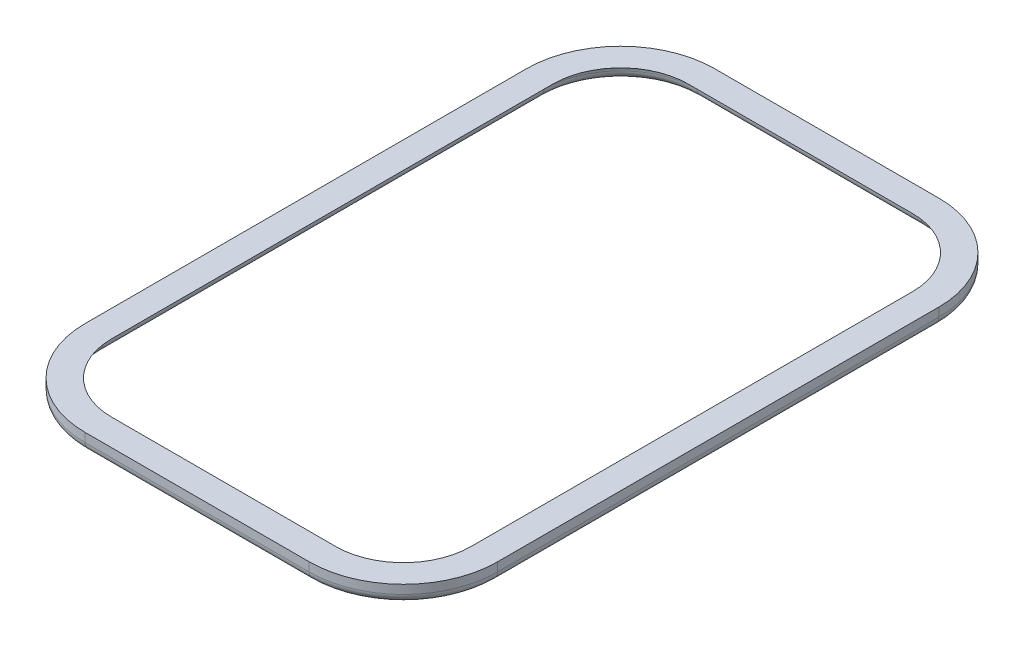
ISO-10303-21;
HEADER;
FILE_DESCRIPTION(('STEP AP214'),'2;1');
FILE_NAME('part.step','',(''),(''),'','','');
FILE_SCHEMA(('AUTOMOTIVE_DESIGN { 1 0 10303 214 1 1 1 1 }'));
ENDSEC;
DATA;
#1=APPLICATION_CONTEXT('core data for automotive mechanical design processes');
#2=APPLICATION_PROTOCOL_DEFINITION('international standard','automotive_design',2000,#1);
#3=PRODUCT_CONTEXT('',#1,'mechanical');
#4=PRODUCT('Part','Part','',(#3));
#5=PRODUCT_RELATED_PRODUCT_CATEGORY('part','',(#4));
#6=PRODUCT_DEFINITION_FORMATION('','',#4);
#7=PRODUCT_DEFINITION_CONTEXT('part definition',#1,'design');
#8=PRODUCT_DEFINITION('design','',#6,#7);
#9=PRODUCT_DEFINITION_SHAPE('','',#8);
#10=(LENGTH_UNIT() NAMED_UNIT(*) SI_UNIT(.MILLI.,.METRE.));
#11=(NAMED_UNIT(*) PLANE_ANGLE_UNIT() SI_UNIT($,.RADIAN.));
#12=(NAMED_UNIT(*) SI_UNIT($,.STERADIAN.) SOLID_ANGLE_UNIT());
#13=UNCERTAINTY_MEASURE_WITH_UNIT(LENGTH_MEASURE(1.E-05),#10,'distance_accuracy_value','');
#14=(GEOMETRIC_REPRESENTATION_CONTEXT(3) GLOBAL_UNCERTAINTY_ASSIGNED_CONTEXT((#13)) GLOBAL_UNIT_ASSIGNED_CONTEXT((#10,
#11,#12)) REPRESENTATION_CONTEXT('',''));
#15=CARTESIAN_POINT('',(0.,0.,0.));
#16=DIRECTION('',(0.,0.,1.));
#17=DIRECTION('',(1.,0.,0.));
#18=AXIS2_PLACEMENT_3D('',#15,#16,#17);
#19=CARTESIAN_POINT('',(51.1,0.,-86.5));
#20=DIRECTION('',(0.,-1.,0.));
#21=DIRECTION('',(0.,0.,-1.));
#22=AXIS2_PLACEMENT_3D('',#19,#20,#21);
#23=PLANE('',#22);
#24=CARTESIAN_POINT('',(51.1,0.,-75.));
#25=DIRECTION('',(0.,-1.,0.));
#26=DIRECTION('',(0.,0.,-1.));
#27=AXIS2_PLACEMENT_3D('',#24,#25,#26);
#28=CIRCLE('',#27,16.);
#29=CARTESIAN_POINT('',(67.1,0.,-75.));
#30=VERTEX_POINT('',#29);
#31=CARTESIAN_POINT('',(51.1,0.,-91.));
#32=VERTEX_POINT('',#31);
#33=EDGE_CURVE('E231',#30,#32,#28,.F.);
#34=ORIENTED_EDGE('',*,*,#33,.T.);
#35=DIRECTION('',(-1.,0.,0.));
#36=VECTOR('',#35,1.);
#37=CARTESIAN_POINT('',(0.,0.,-91.));
#38=LINE('',#37,#36);
#39=CARTESIAN_POINT('',(13.,0.,-91.));
#40=VERTEX_POINT('',#39);
#41=EDGE_CURVE('E225',#32,#40,#38,.T.);
#42=ORIENTED_EDGE('',*,*,#41,.T.);
#43=CARTESIAN_POINT('',(13.,0.,-75.));
#44=DIRECTION('',(0.,-1.,0.));
#45=DIRECTION('',(0.,0.,-1.));
#46=AXIS2_PLACEMENT_3D('',#43,#44,#45);
#47=CIRCLE('',#46,16.);
#48=CARTESIAN_POINT('',(-3.00000000000003,0.,-75.));
#49=VERTEX_POINT('',#48);
#50=EDGE_CURVE('E228',#40,#49,#47,.F.);
#51=ORIENTED_EDGE('',*,*,#50,.T.);
#52=DIRECTION('',(0.,0.,1.));
#53=VECTOR('',#52,1.);
#54=CARTESIAN_POINT('',(-3.00000000000003,0.,0.));
#55=LINE('',#54,#53);
#56=CARTESIAN_POINT('',(-3.,0.,0.));
#57=VERTEX_POINT('',#56);
#58=EDGE_CURVE('E221',#49,#57,#55,.T.);
#59=ORIENTED_EDGE('',*,*,#58,.T.);
#60=CARTESIAN_POINT('',(13.,0.,0.));
#61=DIRECTION('',(0.,-1.,0.));
#62=DIRECTION('',(0.,0.,-1.));
#63=AXIS2_PLACEMENT_3D('',#60,#61,#62);
#64=CIRCLE('',#63,16.);
#65=CARTESIAN_POINT('',(13.,0.,16.));
#66=VERTEX_POINT('',#65);
#67=EDGE_CURVE('E237',#57,#66,#64,.F.);
#68=ORIENTED_EDGE('',*,*,#67,.T.);
#69=DIRECTION('',(-1.,0.,0.));
#70=VECTOR('',#69,1.);
#71=CARTESIAN_POINT('',(0.,0.,16.));
#72=LINE('',#71,#70);
#73=CARTESIAN_POINT('',(51.1,0.,16.));
#74=VERTEX_POINT('',#73);
#75=EDGE_CURVE('E188',#74,#66,#72,.T.);
#76=ORIENTED_EDGE('',*,*,#75,.F.);
#77=CARTESIAN_POINT('',(51.1,0.,0.));
#78=DIRECTION('',(0.,-1.,0.));
#79=DIRECTION('',(0.,0.,-1.));
#80=AXIS2_PLACEMENT_3D('',#77,#78,#79);
#81=CIRCLE('',#80,16.);
#82=CARTESIAN_POINT('',(67.1,0.,0.));
#83=VERTEX_POINT('',#82);
#84=EDGE_CURVE('E234',#74,#83,#81,.F.);
#85=ORIENTED_EDGE('',*,*,#84,.T.);
#86=DIRECTION('',(0.,0.,1.));
#87=VECTOR('',#86,1.);
#88=CARTESIAN_POINT('',(67.1,0.,0.));
#89=LINE('',#88,#87);
#90=EDGE_CURVE('E224',#30,#83,#89,.T.);
#91=ORIENTED_EDGE('',*,*,#90,.F.);
#92=EDGE_LOOP('',(#34,#42,#51,#59,#68,#76,#85,#91));
#93=FACE_BOUND('',#92,.T.);
#94=CARTESIAN_POINT('',(13.,0.,-75.));
#95=DIRECTION('',(0.,1.,0.));
#96=DIRECTION('',(0.,0.,1.));
#97=AXIS2_PLACEMENT_3D('',#94,#95,#96);
#98=CIRCLE('',#97,11.5);
#99=CARTESIAN_POINT('',(1.49999999999997,0.,-75.));
#100=VERTEX_POINT('',#99);
#101=CARTESIAN_POINT('',(13.,0.,-86.5));
#102=VERTEX_POINT('',#101);
#103=EDGE_CURVE('E246',#100,#102,#98,.F.);
#104=ORIENTED_EDGE('',*,*,#103,.T.);
#105=DIRECTION('',(1.,0.,0.));
#106=VECTOR('',#105,1.);
#107=CARTESIAN_POINT('',(0.,0.,-86.5));
#108=LINE('',#107,#106);
#109=CARTESIAN_POINT('',(51.1,0.,-86.5));
#110=VERTEX_POINT('',#109);
#111=EDGE_CURVE('E243',#102,#110,#108,.T.);
#112=ORIENTED_EDGE('',*,*,#111,.T.);
#113=CARTESIAN_POINT('',(51.1,0.,-75.));
#114=DIRECTION('',(0.,1.,0.));
#115=DIRECTION('',(0.,0.,1.));
#116=AXIS2_PLACEMENT_3D('',#113,#114,#115);
#117=CIRCLE('',#116,11.5);
#118=CARTESIAN_POINT('',(62.6,0.,-75.));
#119=VERTEX_POINT('',#118);
#120=EDGE_CURVE('E240',#110,#119,#117,.F.);
#121=ORIENTED_EDGE('',*,*,#120,.T.);
#122=DIRECTION('',(0.,0.,1.));
#123=VECTOR('',#122,1.);
#124=CARTESIAN_POINT('',(62.6,0.,0.));
#125=LINE('',#124,#123);
#126=CARTESIAN_POINT('',(62.6,0.,0.));
#127=VERTEX_POINT('',#126);
#128=EDGE_CURVE('E44',#119,#127,#125,.T.);
#129=ORIENTED_EDGE('',*,*,#128,.T.);
#130=CARTESIAN_POINT('',(51.1,0.,0.));
#131=DIRECTION('',(0.,1.,0.));
#132=DIRECTION('',(0.,0.,1.));
#133=AXIS2_PLACEMENT_3D('',#130,#131,#132);
#134=CIRCLE('',#133,11.5);
#135=CARTESIAN_POINT('',(51.1,0.,11.5));
#136=VERTEX_POINT('',#135);
#137=EDGE_CURVE('E257',#127,#136,#134,.F.);
#138=ORIENTED_EDGE('',*,*,#137,.T.);
#139=DIRECTION('',(-1.,0.,0.));
#140=VECTOR('',#139,1.);
#141=CARTESIAN_POINT('',(0.,0.,11.5));
#142=LINE('',#141,#140);
#143=CARTESIAN_POINT('',(13.,0.,11.5));
#144=VERTEX_POINT('',#143);
#145=EDGE_CURVE('E255',#136,#144,#142,.T.);
#146=ORIENTED_EDGE('',*,*,#145,.T.);
#147=CARTESIAN_POINT('',(13.,0.,0.));
#148=DIRECTION('',(0.,1.,0.));
#149=DIRECTION('',(0.,0.,1.));
#150=AXIS2_PLACEMENT_3D('',#147,#148,#149);
#151=CIRCLE('',#150,11.5);
#152=CARTESIAN_POINT('',(1.49999999999997,0.,0.));
#153=VERTEX_POINT('',#152);
#154=EDGE_CURVE('E252',#144,#153,#151,.F.);
#155=ORIENTED_EDGE('',*,*,#154,.T.);
#156=DIRECTION('',(0.,0.,-1.));
#157=VECTOR('',#156,1.);
#158=CARTESIAN_POINT('',(1.49999999999997,0.,0.));
#159=LINE('',#158,#157);
#160=EDGE_CURVE('E249',#153,#100,#159,.T.);
#161=ORIENTED_EDGE('',*,*,#160,.T.);
#162=EDGE_LOOP('',(#104,#112,#121,#129,#138,#146,#155,#161));
#163=FACE_BOUND('',#162,.T.);
#164=ADVANCED_FACE('F41',(#93,#163),#23,.F.);
#165=CARTESIAN_POINT('',(65.6,-1.5,0.));
#166=DIRECTION('',(0.,0.,-1.));
#167=DIRECTION('',(-1.,0.,0.));
#168=AXIS2_PLACEMENT_3D('',#165,#166,#167);
#169=CYLINDRICAL_SURFACE('',#168,1.5);
#170=CARTESIAN_POINT('',(65.6,-1.5,-75.));
#171=DIRECTION('',(0.,0.,1.));
#172=DIRECTION('',(1.,0.,0.));
#173=AXIS2_PLACEMENT_3D('',#170,#171,#172);
#174=CIRCLE('',#173,1.5);
#175=CARTESIAN_POINT('',(65.6,-3.,-75.));
#176=VERTEX_POINT('',#175);
#177=CARTESIAN_POINT('',(67.1,-1.49999999999999,-75.));
#178=VERTEX_POINT('',#177);
#179=EDGE_CURVE('E179',#176,#178,#174,.T.);
#180=ORIENTED_EDGE('',*,*,#179,.T.);
#181=DIRECTION('',(0.,0.,1.));
#182=VECTOR('',#181,1.);
#183=CARTESIAN_POINT('',(67.1,-1.5,-75.));
#184=LINE('',#183,#182);
#185=CARTESIAN_POINT('',(67.1,-1.49999999999999,0.));
#186=VERTEX_POINT('',#185);
#187=EDGE_CURVE('E203',#186,#178,#184,.F.);
#188=ORIENTED_EDGE('',*,*,#187,.F.);
#189=CARTESIAN_POINT('',(65.6,-1.5,0.));
#190=DIRECTION('',(0.,0.,-1.));
#191=DIRECTION('',(-1.,0.,0.));
#192=AXIS2_PLACEMENT_3D('',#189,#190,#191);
#193=CIRCLE('',#192,1.5);
#194=CARTESIAN_POINT('',(65.6,-3.,0.));
#195=VERTEX_POINT('',#194);
#196=EDGE_CURVE('E11',#186,#195,#193,.T.);
#197=ORIENTED_EDGE('',*,*,#196,.T.);
#198=DIRECTION('',(0.,0.,1.));
#199=VECTOR('',#198,1.);
#200=CARTESIAN_POINT('',(65.6,-3.,0.));
#201=LINE('',#200,#199);
#202=EDGE_CURVE('E50',#195,#176,#201,.F.);
#203=ORIENTED_EDGE('',*,*,#202,.T.);
#204=EDGE_LOOP('',(#180,#188,#197,#203));
#205=FACE_BOUND('',#204,.T.);
#206=ADVANCED_FACE('F302',(#205),#169,.T.);
#207=CARTESIAN_POINT('',(-1.50000000000003,-1.5,0.));
#208=DIRECTION('',(0.,0.,-1.));
#209=DIRECTION('',(-1.,0.,0.));
#210=AXIS2_PLACEMENT_3D('',#207,#208,#209);
#211=CYLINDRICAL_SURFACE('',#210,1.5);
#212=CARTESIAN_POINT('',(-1.50000000000003,-1.5,0.));
#213=DIRECTION('',(0.,0.,1.));
#214=DIRECTION('',(1.,0.,0.));
#215=AXIS2_PLACEMENT_3D('',#212,#213,#214);
#216=CIRCLE('',#215,1.5);
#217=CARTESIAN_POINT('',(-3.,-1.49999999999999,0.));
#218=VERTEX_POINT('',#217);
#219=CARTESIAN_POINT('',(-1.50000000000003,-3.,0.));
#220=VERTEX_POINT('',#219);
#221=EDGE_CURVE('E353',#218,#220,#216,.T.);
#222=ORIENTED_EDGE('',*,*,#221,.F.);
#223=DIRECTION('',(0.,0.,-1.));
#224=VECTOR('',#223,1.);
#225=CARTESIAN_POINT('',(-3.00000000000003,-1.5,0.));
#226=LINE('',#225,#224);
#227=CARTESIAN_POINT('',(-3.00000000000003,-1.49999999999999,-75.));
#228=VERTEX_POINT('',#227);
#229=EDGE_CURVE('E193',#228,#218,#226,.F.);
#230=ORIENTED_EDGE('',*,*,#229,.F.);
#231=CARTESIAN_POINT('',(-1.50000000000003,-1.5,-75.));
#232=DIRECTION('',(0.,0.,-1.));
#233=DIRECTION('',(-1.,0.,0.));
#234=AXIS2_PLACEMENT_3D('',#231,#232,#233);
#235=CIRCLE('',#234,1.5);
#236=CARTESIAN_POINT('',(-1.50000000000003,-3.,-75.));
#237=VERTEX_POINT('',#236);
#238=EDGE_CURVE('E375',#237,#228,#235,.T.);
#239=ORIENTED_EDGE('',*,*,#238,.F.);
#240=DIRECTION('',(0.,0.,-1.));
#241=VECTOR('',#240,1.);
#242=CARTESIAN_POINT('',(-1.50000000000003,-3.,0.));
#243=LINE('',#242,#241);
#244=EDGE_CURVE('E378',#237,#220,#243,.F.);
#245=ORIENTED_EDGE('',*,*,#244,.T.);
#246=EDGE_LOOP('',(#222,#230,#239,#245));
#247=FACE_BOUND('',#246,.T.);
#248=ADVANCED_FACE('F478',(#247),#211,.T.);
#249=CARTESIAN_POINT('',(0.,-1.5,14.5));
#250=DIRECTION('',(1.,0.,0.));
#251=DIRECTION('',(0.,0.,-1.));
#252=AXIS2_PLACEMENT_3D('',#249,#250,#251);
#253=CYLINDRICAL_SURFACE('',#252,1.5);
#254=CARTESIAN_POINT('',(13.,-1.5,14.5));
#255=DIRECTION('',(1.,0.,0.));
#256=DIRECTION('',(0.,0.,-1.));
#257=AXIS2_PLACEMENT_3D('',#254,#255,#256);
#258=CIRCLE('',#257,1.5);
#259=CARTESIAN_POINT('',(13.,-1.5,16.));
#260=VERTEX_POINT('',#259);
#261=CARTESIAN_POINT('',(13.,-3.,14.5));
#262=VERTEX_POINT('',#261);
#263=EDGE_CURVE('E169',#260,#262,#258,.T.);
#264=ORIENTED_EDGE('',*,*,#263,.T.);
#265=DIRECTION('',(-1.,0.,0.));
#266=VECTOR('',#265,1.);
#267=CARTESIAN_POINT('',(0.,-3.,14.5));
#268=LINE('',#267,#266);
#269=CARTESIAN_POINT('',(51.1,-3.,14.5));
#270=VERTEX_POINT('',#269);
#271=EDGE_CURVE('E154',#262,#270,#268,.F.);
#272=ORIENTED_EDGE('',*,*,#271,.T.);
#273=CARTESIAN_POINT('',(51.1,-1.5,14.5));
#274=DIRECTION('',(1.,0.,0.));
#275=DIRECTION('',(0.,0.,-1.));
#276=AXIS2_PLACEMENT_3D('',#273,#274,#275);
#277=CIRCLE('',#276,1.5);
#278=CARTESIAN_POINT('',(51.1,-1.5,16.));
#279=VERTEX_POINT('',#278);
#280=EDGE_CURVE('E166',#279,#270,#277,.T.);
#281=ORIENTED_EDGE('',*,*,#280,.F.);
#282=DIRECTION('',(-1.,0.,0.));
#283=VECTOR('',#282,1.);
#284=CARTESIAN_POINT('',(51.1,-1.5,16.));
#285=LINE('',#284,#283);
#286=EDGE_CURVE('E187',#260,#279,#285,.F.);
#287=ORIENTED_EDGE('',*,*,#286,.F.);
#288=EDGE_LOOP('',(#264,#272,#281,#287));
#289=FACE_BOUND('',#288,.T.);
#290=ADVANCED_FACE('F163',(#289),#253,.T.);
#291=CARTESIAN_POINT('',(0.,-1.5,-89.5));
#292=DIRECTION('',(1.,0.,0.));
#293=DIRECTION('',(0.,0.,-1.));
#294=AXIS2_PLACEMENT_3D('',#291,#292,#293);
#295=CYLINDRICAL_SURFACE('',#294,1.5);
#296=CARTESIAN_POINT('',(13.,-1.5,-89.5));
#297=DIRECTION('',(1.,0.,0.));
#298=DIRECTION('',(0.,0.,-1.));
#299=AXIS2_PLACEMENT_3D('',#296,#297,#298);
#300=CIRCLE('',#299,1.5);
#301=CARTESIAN_POINT('',(13.,-3.,-89.5));
#302=VERTEX_POINT('',#301);
#303=CARTESIAN_POINT('',(13.,-1.5,-91.));
#304=VERTEX_POINT('',#303);
#305=EDGE_CURVE('E337',#302,#304,#300,.T.);
#306=ORIENTED_EDGE('',*,*,#305,.T.);
#307=DIRECTION('',(1.,0.,0.));
#308=VECTOR('',#307,1.);
#309=CARTESIAN_POINT('',(0.,-1.5,-91.));
#310=LINE('',#309,#308);
#311=CARTESIAN_POINT('',(51.1,-1.5,-91.));
#312=VERTEX_POINT('',#311);
#313=EDGE_CURVE('E199',#312,#304,#310,.F.);
#314=ORIENTED_EDGE('',*,*,#313,.F.);
#315=CARTESIAN_POINT('',(51.1,-1.5,-89.5));
#316=DIRECTION('',(1.,0.,0.));
#317=DIRECTION('',(0.,0.,-1.));
#318=AXIS2_PLACEMENT_3D('',#315,#316,#317);
#319=CIRCLE('',#318,1.5);
#320=CARTESIAN_POINT('',(51.1,-3.,-89.5));
#321=VERTEX_POINT('',#320);
#322=EDGE_CURVE('E287',#321,#312,#319,.T.);
#323=ORIENTED_EDGE('',*,*,#322,.F.);
#324=DIRECTION('',(1.,0.,0.));
#325=VECTOR('',#324,1.);
#326=CARTESIAN_POINT('',(0.,-3.,-89.5));
#327=LINE('',#326,#325);
#328=EDGE_CURVE('E348',#321,#302,#327,.F.);
#329=ORIENTED_EDGE('',*,*,#328,.T.);
#330=EDGE_LOOP('',(#306,#314,#323,#329));
#331=FACE_BOUND('',#330,.T.);
#332=ADVANCED_FACE('F334',(#331),#295,.T.);
#333=CARTESIAN_POINT('',(13.,-1.5,-75.));
#334=DIRECTION('',(0.,-1.,0.));
#335=DIRECTION('',(0.,0.,-1.));
#336=AXIS2_PLACEMENT_3D('',#333,#334,#335);
#337=TOROIDAL_SURFACE('',#336,14.5,1.5);
#338=ORIENTED_EDGE('',*,*,#238,.T.);
#339=CARTESIAN_POINT('',(13.,-1.5,-75.));
#340=DIRECTION('',(0.,-1.,0.));
#341=DIRECTION('',(0.,0.,-1.));
#342=AXIS2_PLACEMENT_3D('',#339,#340,#341);
#343=CIRCLE('',#342,16.);
#344=EDGE_CURVE('E196',#304,#228,#343,.F.);
#345=ORIENTED_EDGE('',*,*,#344,.F.);
#346=ORIENTED_EDGE('',*,*,#305,.F.);
#347=CARTESIAN_POINT('',(13.,-3.,-75.));
#348=DIRECTION('',(0.,-1.,0.));
#349=DIRECTION('',(0.,0.,-1.));
#350=AXIS2_PLACEMENT_3D('',#347,#348,#349);
#351=CIRCLE('',#350,14.5);
#352=EDGE_CURVE('E372',#302,#237,#351,.F.);
#353=ORIENTED_EDGE('',*,*,#352,.T.);
#354=EDGE_LOOP('',(#338,#345,#346,#353));
#355=FACE_BOUND('',#354,.T.);
#356=ADVANCED_FACE('F502',(#355),#337,.T.);
#357=CARTESIAN_POINT('',(0.,3.,-91.));
#358=DIRECTION('',(0.,0.,-1.));
#359=DIRECTION('',(-1.,0.,0.));
#360=AXIS2_PLACEMENT_3D('',#357,#358,#359);
#361=PLANE('',#360);
#362=ORIENTED_EDGE('',*,*,#41,.F.);
#363=DIRECTION('',(0.,-1.,0.));
#364=VECTOR('',#363,1.);
#365=CARTESIAN_POINT('',(51.1,0.,-91.));
#366=LINE('',#365,#364);
#367=EDGE_CURVE('E212',#32,#312,#366,.T.);
#368=ORIENTED_EDGE('',*,*,#367,.T.);
#369=ORIENTED_EDGE('',*,*,#313,.T.);
#370=DIRECTION('',(0.,-1.,0.));
#371=VECTOR('',#370,1.);
#372=CARTESIAN_POINT('',(13.,3.,-91.));
#373=LINE('',#372,#371);
#374=EDGE_CURVE('E209',#304,#40,#373,.F.);
#375=ORIENTED_EDGE('',*,*,#374,.T.);
#376=EDGE_LOOP('',(#362,#368,#369,#375));
#377=FACE_BOUND('',#376,.T.);
#378=ADVANCED_FACE('F329',(#377),#361,.T.);
#379=CARTESIAN_POINT('',(51.1,-1.5,-75.));
#380=DIRECTION('',(0.,-1.,0.));
#381=DIRECTION('',(0.,0.,-1.));
#382=AXIS2_PLACEMENT_3D('',#379,#380,#381);
#383=TOROIDAL_SURFACE('',#382,14.5,1.5);
#384=ORIENTED_EDGE('',*,*,#322,.T.);
#385=CARTESIAN_POINT('',(51.1,-1.5,-75.));
#386=DIRECTION('',(0.,-1.,0.));
#387=DIRECTION('',(0.,0.,-1.));
#388=AXIS2_PLACEMENT_3D('',#385,#386,#387);
#389=CIRCLE('',#388,16.);
#390=EDGE_CURVE('E201',#178,#312,#389,.F.);
#391=ORIENTED_EDGE('',*,*,#390,.F.);
#392=ORIENTED_EDGE('',*,*,#179,.F.);
#393=CARTESIAN_POINT('',(51.1,-3.,-75.));
#394=DIRECTION('',(0.,-1.,0.));
#395=DIRECTION('',(0.,0.,-1.));
#396=AXIS2_PLACEMENT_3D('',#393,#394,#395);
#397=CIRCLE('',#396,14.5);
#398=EDGE_CURVE('E290',#176,#321,#397,.F.);
#399=ORIENTED_EDGE('',*,*,#398,.T.);
#400=EDGE_LOOP('',(#384,#391,#392,#399));
#401=FACE_BOUND('',#400,.T.);
#402=ADVANCED_FACE('F339',(#401),#383,.T.);
#403=CARTESIAN_POINT('',(67.1,3.,0.));
#404=DIRECTION('',(-1.,0.,0.));
#405=DIRECTION('',(0.,0.,1.));
#406=AXIS2_PLACEMENT_3D('',#403,#404,#405);
#407=PLANE('',#406);
#408=DIRECTION('',(0.,-1.,0.));
#409=VECTOR('',#408,1.);
#410=CARTESIAN_POINT('',(67.1,61.,-75.));
#411=LINE('',#410,#409);
#412=EDGE_CURVE('E90',#30,#178,#411,.T.);
#413=ORIENTED_EDGE('',*,*,#412,.F.);
#414=ORIENTED_EDGE('',*,*,#90,.T.);
#415=DIRECTION('',(0.,-1.,0.));
#416=VECTOR('',#415,1.);
#417=CARTESIAN_POINT('',(67.1,61.,0.));
#418=LINE('',#417,#416);
#419=EDGE_CURVE('E98',#83,#186,#418,.T.);
#420=ORIENTED_EDGE('',*,*,#419,.T.);
#421=ORIENTED_EDGE('',*,*,#187,.T.);
#422=EDGE_LOOP('',(#413,#414,#420,#421));
#423=FACE_BOUND('',#422,.T.);
#424=ADVANCED_FACE('F304',(#423),#407,.F.);
#425=CARTESIAN_POINT('',(51.1,-1.5,0.));
#426=DIRECTION('',(0.,-1.,0.));
#427=DIRECTION('',(0.,0.,-1.));
#428=AXIS2_PLACEMENT_3D('',#425,#426,#427);
#429=TOROIDAL_SURFACE('',#428,14.5,1.5);
#430=ORIENTED_EDGE('',*,*,#280,.T.);
#431=CARTESIAN_POINT('',(51.1,-3.,0.));
#432=DIRECTION('',(0.,-1.,0.));
#433=DIRECTION('',(0.,0.,-1.));
#434=AXIS2_PLACEMENT_3D('',#431,#432,#433);
#435=CIRCLE('',#434,14.5);
#436=EDGE_CURVE('E171',#270,#195,#435,.F.);
#437=ORIENTED_EDGE('',*,*,#436,.T.);
#438=ORIENTED_EDGE('',*,*,#196,.F.);
#439=CARTESIAN_POINT('',(51.1,-1.5,0.));
#440=DIRECTION('',(0.,-1.,0.));
#441=DIRECTION('',(0.,0.,-1.));
#442=AXIS2_PLACEMENT_3D('',#439,#440,#441);
#443=CIRCLE('',#442,16.);
#444=EDGE_CURVE('E178',#279,#186,#443,.F.);
#445=ORIENTED_EDGE('',*,*,#444,.F.);
#446=EDGE_LOOP('',(#430,#437,#438,#445));
#447=FACE_BOUND('',#446,.T.);
#448=ADVANCED_FACE('F177',(#447),#429,.T.);
#449=CARTESIAN_POINT('',(0.,3.,16.));
#450=DIRECTION('',(0.,0.,-1.));
#451=DIRECTION('',(-1.,0.,0.));
#452=AXIS2_PLACEMENT_3D('',#449,#450,#451);
#453=PLANE('',#452);
#454=DIRECTION('',(0.,-1.,0.));
#455=VECTOR('',#454,1.);
#456=CARTESIAN_POINT('',(51.1,3.,16.));
#457=LINE('',#456,#455);
#458=EDGE_CURVE('E205',#279,#74,#457,.F.);
#459=ORIENTED_EDGE('',*,*,#458,.T.);
#460=ORIENTED_EDGE('',*,*,#75,.T.);
#461=DIRECTION('',(0.,-1.,0.));
#462=VECTOR('',#461,1.);
#463=CARTESIAN_POINT('',(13.,0.,16.));
#464=LINE('',#463,#462);
#465=EDGE_CURVE('E208',#66,#260,#464,.T.);
#466=ORIENTED_EDGE('',*,*,#465,.T.);
#467=ORIENTED_EDGE('',*,*,#286,.T.);
#468=EDGE_LOOP('',(#459,#460,#466,#467));
#469=FACE_BOUND('',#468,.T.);
#470=ADVANCED_FACE('F410',(#469),#453,.F.);
#471=CARTESIAN_POINT('',(13.,-1.5,0.));
#472=DIRECTION('',(0.,-1.,0.));
#473=DIRECTION('',(0.,0.,-1.));
#474=AXIS2_PLACEMENT_3D('',#471,#472,#473);
#475=TOROIDAL_SURFACE('',#474,14.5,1.5);
#476=ORIENTED_EDGE('',*,*,#221,.T.);
#477=CARTESIAN_POINT('',(13.,-3.,0.));
#478=DIRECTION('',(0.,-1.,0.));
#479=DIRECTION('',(0.,0.,-1.));
#480=AXIS2_PLACEMENT_3D('',#477,#478,#479);
#481=CIRCLE('',#480,14.5);
#482=EDGE_CURVE('E356',#220,#262,#481,.F.);
#483=ORIENTED_EDGE('',*,*,#482,.T.);
#484=ORIENTED_EDGE('',*,*,#263,.F.);
#485=CARTESIAN_POINT('',(13.,-1.5,0.));
#486=DIRECTION('',(0.,-1.,0.));
#487=DIRECTION('',(0.,0.,-1.));
#488=AXIS2_PLACEMENT_3D('',#485,#486,#487);
#489=CIRCLE('',#488,16.);
#490=EDGE_CURVE('E190',#218,#260,#489,.F.);
#491=ORIENTED_EDGE('',*,*,#490,.F.);
#492=EDGE_LOOP('',(#476,#483,#484,#491));
#493=FACE_BOUND('',#492,.T.);
#494=ADVANCED_FACE('F420',(#493),#475,.T.);
#495=CARTESIAN_POINT('',(-3.00000000000003,3.,0.));
#496=DIRECTION('',(-1.,0.,0.));
#497=DIRECTION('',(0.,0.,1.));
#498=AXIS2_PLACEMENT_3D('',#495,#496,#497);
#499=PLANE('',#498);
#500=ORIENTED_EDGE('',*,*,#58,.F.);
#501=DIRECTION('',(0.,-1.,0.));
#502=VECTOR('',#501,1.);
#503=CARTESIAN_POINT('',(-3.00000000000003,61.,-75.));
#504=LINE('',#503,#502);
#505=EDGE_CURVE('E215',#49,#228,#504,.T.);
#506=ORIENTED_EDGE('',*,*,#505,.T.);
#507=ORIENTED_EDGE('',*,*,#229,.T.);
#508=DIRECTION('',(0.,-1.,0.));
#509=VECTOR('',#508,1.);
#510=CARTESIAN_POINT('',(-3.,61.,0.));
#511=LINE('',#510,#509);
#512=EDGE_CURVE('E213',#57,#218,#511,.T.);
#513=ORIENTED_EDGE('',*,*,#512,.F.);
#514=EDGE_LOOP('',(#500,#506,#507,#513));
#515=FACE_BOUND('',#514,.T.);
#516=ADVANCED_FACE('F489',(#515),#499,.T.);
#517=CARTESIAN_POINT('',(13.,3.,0.));
#518=DIRECTION('',(0.,1.,0.));
#519=DIRECTION('',(0.,0.,1.));
#520=AXIS2_PLACEMENT_3D('',#517,#518,#519);
#521=CYLINDRICAL_SURFACE('',#520,16.);
#522=ORIENTED_EDGE('',*,*,#67,.F.);
#523=ORIENTED_EDGE('',*,*,#512,.T.);
#524=ORIENTED_EDGE('',*,*,#490,.T.);
#525=ORIENTED_EDGE('',*,*,#465,.F.);
#526=EDGE_LOOP('',(#522,#523,#524,#525));
#527=FACE_BOUND('',#526,.T.);
#528=ADVANCED_FACE('F417',(#527),#521,.T.);
#529=CARTESIAN_POINT('',(51.1,3.,0.));
#530=DIRECTION('',(0.,-1.,0.));
#531=DIRECTION('',(0.,0.,-1.));
#532=AXIS2_PLACEMENT_3D('',#529,#530,#531);
#533=CYLINDRICAL_SURFACE('',#532,16.);
#534=ORIENTED_EDGE('',*,*,#84,.F.);
#535=ORIENTED_EDGE('',*,*,#458,.F.);
#536=ORIENTED_EDGE('',*,*,#444,.T.);
#537=ORIENTED_EDGE('',*,*,#419,.F.);
#538=EDGE_LOOP('',(#534,#535,#536,#537));
#539=FACE_BOUND('',#538,.T.);
#540=ADVANCED_FACE('F423',(#539),#533,.T.);
#541=CARTESIAN_POINT('',(51.1,3.,-75.));
#542=DIRECTION('',(0.,1.,0.));
#543=DIRECTION('',(0.,0.,1.));
#544=AXIS2_PLACEMENT_3D('',#541,#542,#543);
#545=CYLINDRICAL_SURFACE('',#544,16.);
#546=ORIENTED_EDGE('',*,*,#33,.F.);
#547=ORIENTED_EDGE('',*,*,#412,.T.);
#548=ORIENTED_EDGE('',*,*,#390,.T.);
#549=ORIENTED_EDGE('',*,*,#367,.F.);
#550=EDGE_LOOP('',(#546,#547,#548,#549));
#551=FACE_BOUND('',#550,.T.);
#552=ADVANCED_FACE('F492',(#551),#545,.T.);
#553=CARTESIAN_POINT('',(13.,3.,-75.));
#554=DIRECTION('',(0.,-1.,0.));
#555=DIRECTION('',(0.,0.,-1.));
#556=AXIS2_PLACEMENT_3D('',#553,#554,#555);
#557=CYLINDRICAL_SURFACE('',#556,16.);
#558=ORIENTED_EDGE('',*,*,#50,.F.);
#559=ORIENTED_EDGE('',*,*,#374,.F.);
#560=ORIENTED_EDGE('',*,*,#344,.T.);
#561=ORIENTED_EDGE('',*,*,#505,.F.);
#562=EDGE_LOOP('',(#558,#559,#560,#561));
#563=FACE_BOUND('',#562,.T.);
#564=ADVANCED_FACE('F325',(#563),#557,.T.);
#565=CARTESIAN_POINT('',(-1.50000000000003,-1.5,0.));
#566=DIRECTION('',(0.,0.,-1.));
#567=DIRECTION('',(-1.,0.,0.));
#568=AXIS2_PLACEMENT_3D('',#565,#566,#567);
#569=CYLINDRICAL_SURFACE('',#568,1.5);
#570=CARTESIAN_POINT('',(-1.50000000000003,-1.5,-75.));
#571=DIRECTION('',(0.,0.,-1.));
#572=DIRECTION('',(-1.,0.,0.));
#573=AXIS2_PLACEMENT_3D('',#570,#571,#572);
#574=CIRCLE('',#573,1.5);
#575=CARTESIAN_POINT('',(0.,-1.5,-75.));
#576=VERTEX_POINT('',#575);
#577=EDGE_CURVE('E396',#576,#237,#574,.T.);
#578=ORIENTED_EDGE('',*,*,#577,.F.);
#579=DIRECTION('',(0.,0.,-1.));
#580=VECTOR('',#579,1.);
#581=CARTESIAN_POINT('',(0.,-1.5,0.));
#582=LINE('',#581,#580);
#583=CARTESIAN_POINT('',(0.,-1.5,0.));
#584=VERTEX_POINT('',#583);
#585=EDGE_CURVE('E398',#576,#584,#582,.F.);
#586=ORIENTED_EDGE('',*,*,#585,.T.);
#587=CARTESIAN_POINT('',(-1.50000000000003,-1.5,0.));
#588=DIRECTION('',(0.,0.,1.));
#589=DIRECTION('',(1.,0.,0.));
#590=AXIS2_PLACEMENT_3D('',#587,#588,#589);
#591=CIRCLE('',#590,1.5);
#592=EDGE_CURVE('E381',#220,#584,#591,.T.);
#593=ORIENTED_EDGE('',*,*,#592,.F.);
#594=ORIENTED_EDGE('',*,*,#244,.F.);
#595=EDGE_LOOP('',(#578,#586,#593,#594));
#596=FACE_BOUND('',#595,.T.);
#597=ADVANCED_FACE('F450',(#596),#569,.T.);
#598=CARTESIAN_POINT('',(13.,-1.5,-75.));
#599=DIRECTION('',(0.,-1.,0.));
#600=DIRECTION('',(0.,0.,-1.));
#601=AXIS2_PLACEMENT_3D('',#598,#599,#600);
#602=TOROIDAL_SURFACE('',#601,14.5,1.5);
#603=CARTESIAN_POINT('',(13.,-1.5,-75.));
#604=DIRECTION('',(0.,1.,0.));
#605=DIRECTION('',(0.,0.,1.));
#606=AXIS2_PLACEMENT_3D('',#603,#604,#605);
#607=CIRCLE('',#606,13.);
#608=CARTESIAN_POINT('',(13.,-1.5,-88.));
#609=VERTEX_POINT('',#608);
#610=EDGE_CURVE('E393',#609,#576,#607,.T.);
#611=ORIENTED_EDGE('',*,*,#610,.T.);
#612=ORIENTED_EDGE('',*,*,#577,.T.);
#613=ORIENTED_EDGE('',*,*,#352,.F.);
#614=CARTESIAN_POINT('',(13.,-1.5,-89.5));
#615=DIRECTION('',(1.,0.,0.));
#616=DIRECTION('',(0.,0.,-1.));
#617=AXIS2_PLACEMENT_3D('',#614,#615,#616);
#618=CIRCLE('',#617,1.5);
#619=EDGE_CURVE('E369',#609,#302,#618,.T.);
#620=ORIENTED_EDGE('',*,*,#619,.F.);
#621=EDGE_LOOP('',(#611,#612,#613,#620));
#622=FACE_BOUND('',#621,.T.);
#623=ADVANCED_FACE('F455',(#622),#602,.T.);
#624=CARTESIAN_POINT('',(13.,-1.5,0.));
#625=DIRECTION('',(0.,-1.,0.));
#626=DIRECTION('',(0.,0.,-1.));
#627=AXIS2_PLACEMENT_3D('',#624,#625,#626);
#628=TOROIDAL_SURFACE('',#627,14.5,1.5);
#629=ORIENTED_EDGE('',*,*,#592,.T.);
#630=CARTESIAN_POINT('',(13.,-1.5,0.));
#631=DIRECTION('',(0.,1.,0.));
#632=DIRECTION('',(0.,0.,1.));
#633=AXIS2_PLACEMENT_3D('',#630,#631,#632);
#634=CIRCLE('',#633,13.);
#635=CARTESIAN_POINT('',(13.,-1.5,13.));
#636=VERTEX_POINT('',#635);
#637=EDGE_CURVE('E384',#584,#636,#634,.T.);
#638=ORIENTED_EDGE('',*,*,#637,.T.);
#639=CARTESIAN_POINT('',(13.,-1.5,14.5));
#640=DIRECTION('',(1.,0.,0.));
#641=DIRECTION('',(0.,0.,-1.));
#642=AXIS2_PLACEMENT_3D('',#639,#640,#641);
#643=CIRCLE('',#642,1.5);
#644=EDGE_CURVE('E359',#262,#636,#643,.T.);
#645=ORIENTED_EDGE('',*,*,#644,.F.);
#646=ORIENTED_EDGE('',*,*,#482,.F.);
#647=EDGE_LOOP('',(#629,#638,#645,#646));
#648=FACE_BOUND('',#647,.T.);
#649=ADVANCED_FACE('F648',(#648),#628,.T.);
#650=CARTESIAN_POINT('',(1.49999999999997,-1.5,0.));
#651=DIRECTION('',(0.,0.,-1.));
#652=DIRECTION('',(-1.,0.,0.));
#653=AXIS2_PLACEMENT_3D('',#650,#651,#652);
#654=CYLINDRICAL_SURFACE('',#653,1.5);
#655=CARTESIAN_POINT('',(1.49999999999997,-1.5,-75.));
#656=DIRECTION('',(0.,0.,1.));
#657=DIRECTION('',(1.,0.,0.));
#658=AXIS2_PLACEMENT_3D('',#655,#656,#657);
#659=CIRCLE('',#658,1.5);
#660=EDGE_CURVE('E107',#100,#576,#659,.T.);
#661=ORIENTED_EDGE('',*,*,#660,.F.);
#662=ORIENTED_EDGE('',*,*,#160,.F.);
#663=CARTESIAN_POINT('',(1.49999999999997,-1.5,0.));
#664=DIRECTION('',(0.,0.,-1.));
#665=DIRECTION('',(-1.,0.,0.));
#666=AXIS2_PLACEMENT_3D('',#663,#664,#665);
#667=CIRCLE('',#666,1.5);
#668=EDGE_CURVE('E401',#584,#153,#667,.T.);
#669=ORIENTED_EDGE('',*,*,#668,.F.);
#670=ORIENTED_EDGE('',*,*,#585,.F.);
#671=EDGE_LOOP('',(#661,#662,#669,#670));
#672=FACE_BOUND('',#671,.T.);
#673=ADVANCED_FACE('F447',(#672),#654,.F.);
#674=CARTESIAN_POINT('',(0.,-1.5,-89.5));
#675=DIRECTION('',(1.,0.,0.));
#676=DIRECTION('',(0.,0.,-1.));
#677=AXIS2_PLACEMENT_3D('',#674,#675,#676);
#678=CYLINDRICAL_SURFACE('',#677,1.5);
#679=DIRECTION('',(1.,0.,0.));
#680=VECTOR('',#679,1.);
#681=CARTESIAN_POINT('',(0.,-1.5,-88.));
#682=LINE('',#681,#680);
#683=CARTESIAN_POINT('',(51.1,-1.5,-88.));
#684=VERTEX_POINT('',#683);
#685=EDGE_CURVE('E367',#684,#609,#682,.F.);
#686=ORIENTED_EDGE('',*,*,#685,.T.);
#687=ORIENTED_EDGE('',*,*,#619,.T.);
#688=ORIENTED_EDGE('',*,*,#328,.F.);
#689=CARTESIAN_POINT('',(51.1,-1.5,-89.5));
#690=DIRECTION('',(1.,0.,0.));
#691=DIRECTION('',(0.,0.,-1.));
#692=AXIS2_PLACEMENT_3D('',#689,#690,#691);
#693=CIRCLE('',#692,1.5);
#694=EDGE_CURVE('E345',#684,#321,#693,.T.);
#695=ORIENTED_EDGE('',*,*,#694,.F.);
#696=EDGE_LOOP('',(#686,#687,#688,#695));
#697=FACE_BOUND('',#696,.T.);
#698=ADVANCED_FACE('F666',(#697),#678,.T.);
#699=CARTESIAN_POINT('',(13.,-1.5,-75.));
#700=DIRECTION('',(0.,1.,0.));
#701=DIRECTION('',(0.,0.,1.));
#702=AXIS2_PLACEMENT_3D('',#699,#700,#701);
#703=TOROIDAL_SURFACE('',#702,11.5,1.5);
#704=ORIENTED_EDGE('',*,*,#103,.F.);
#705=ORIENTED_EDGE('',*,*,#660,.T.);
#706=ORIENTED_EDGE('',*,*,#610,.F.);
#707=CARTESIAN_POINT('',(13.,-1.5,-86.5));
#708=DIRECTION('',(-1.,0.,0.));
#709=DIRECTION('',(0.,0.,1.));
#710=AXIS2_PLACEMENT_3D('',#707,#708,#709);
#711=CIRCLE('',#710,1.5);
#712=EDGE_CURVE('E390',#102,#609,#711,.T.);
#713=ORIENTED_EDGE('',*,*,#712,.F.);
#714=EDGE_LOOP('',(#704,#705,#706,#713));
#715=FACE_BOUND('',#714,.T.);
#716=ADVANCED_FACE('F457',(#715),#703,.F.);
#717=CARTESIAN_POINT('',(0.,-1.5,14.5));
#718=DIRECTION('',(-1.,0.,0.));
#719=DIRECTION('',(0.,0.,1.));
#720=AXIS2_PLACEMENT_3D('',#717,#718,#719);
#721=CYLINDRICAL_SURFACE('',#720,1.5);
#722=ORIENTED_EDGE('',*,*,#644,.T.);
#723=DIRECTION('',(-1.,0.,0.));
#724=VECTOR('',#723,1.);
#725=CARTESIAN_POINT('',(0.,-1.5,13.));
#726=LINE('',#725,#724);
#727=CARTESIAN_POINT('',(51.1,-1.5,13.));
#728=VERTEX_POINT('',#727);
#729=EDGE_CURVE('E157',#636,#728,#726,.F.);
#730=ORIENTED_EDGE('',*,*,#729,.T.);
#731=CARTESIAN_POINT('',(51.1,-1.5,14.5));
#732=DIRECTION('',(1.,0.,0.));
#733=DIRECTION('',(0.,0.,-1.));
#734=AXIS2_PLACEMENT_3D('',#731,#732,#733);
#735=CIRCLE('',#734,1.5);
#736=EDGE_CURVE('E150',#270,#728,#735,.T.);
#737=ORIENTED_EDGE('',*,*,#736,.F.);
#738=ORIENTED_EDGE('',*,*,#271,.F.);
#739=EDGE_LOOP('',(#722,#730,#737,#738));
#740=FACE_BOUND('',#739,.T.);
#741=ADVANCED_FACE('F153',(#740),#721,.T.);
#742=CARTESIAN_POINT('',(13.,-1.5,0.));
#743=DIRECTION('',(0.,1.,0.));
#744=DIRECTION('',(0.,0.,1.));
#745=AXIS2_PLACEMENT_3D('',#742,#743,#744);
#746=TOROIDAL_SURFACE('',#745,11.5,1.5);
#747=ORIENTED_EDGE('',*,*,#668,.T.);
#748=ORIENTED_EDGE('',*,*,#154,.F.);
#749=CARTESIAN_POINT('',(13.,-1.5,11.5));
#750=DIRECTION('',(-1.,0.,0.));
#751=DIRECTION('',(0.,0.,1.));
#752=AXIS2_PLACEMENT_3D('',#749,#750,#751);
#753=CIRCLE('',#752,1.5);
#754=EDGE_CURVE('E387',#636,#144,#753,.T.);
#755=ORIENTED_EDGE('',*,*,#754,.F.);
#756=ORIENTED_EDGE('',*,*,#637,.F.);
#757=EDGE_LOOP('',(#747,#748,#755,#756));
#758=FACE_BOUND('',#757,.T.);
#759=ADVANCED_FACE('F445',(#758),#746,.F.);
#760=CARTESIAN_POINT('',(51.1,-1.5,-75.));
#761=DIRECTION('',(0.,-1.,0.));
#762=DIRECTION('',(0.,0.,-1.));
#763=AXIS2_PLACEMENT_3D('',#760,#761,#762);
#764=TOROIDAL_SURFACE('',#763,14.5,1.5);
#765=CARTESIAN_POINT('',(51.1,-1.5,-75.));
#766=DIRECTION('',(0.,1.,0.));
#767=DIRECTION('',(0.,0.,1.));
#768=AXIS2_PLACEMENT_3D('',#765,#766,#767);
#769=CIRCLE('',#768,13.);
#770=CARTESIAN_POINT('',(64.1,-1.5,-75.));
#771=VERTEX_POINT('',#770);
#772=EDGE_CURVE('E282',#771,#684,#769,.T.);
#773=ORIENTED_EDGE('',*,*,#772,.T.);
#774=ORIENTED_EDGE('',*,*,#694,.T.);
#775=ORIENTED_EDGE('',*,*,#398,.F.);
#776=CARTESIAN_POINT('',(65.6,-1.5,-75.));
#777=DIRECTION('',(0.,0.,1.));
#778=DIRECTION('',(1.,0.,0.));
#779=AXIS2_PLACEMENT_3D('',#776,#777,#778);
#780=CIRCLE('',#779,1.5);
#781=EDGE_CURVE('E293',#771,#176,#780,.T.);
#782=ORIENTED_EDGE('',*,*,#781,.F.);
#783=EDGE_LOOP('',(#773,#774,#775,#782));
#784=FACE_BOUND('',#783,.T.);
#785=ADVANCED_FACE('F343',(#784),#764,.T.);
#786=CARTESIAN_POINT('',(0.,-1.5,-86.5));
#787=DIRECTION('',(1.,0.,0.));
#788=DIRECTION('',(0.,0.,-1.));
#789=AXIS2_PLACEMENT_3D('',#786,#787,#788);
#790=CYLINDRICAL_SURFACE('',#789,1.5);
#791=ORIENTED_EDGE('',*,*,#111,.F.);
#792=ORIENTED_EDGE('',*,*,#712,.T.);
#793=ORIENTED_EDGE('',*,*,#685,.F.);
#794=CARTESIAN_POINT('',(51.1,-1.5,-86.5));
#795=DIRECTION('',(-1.,0.,0.));
#796=DIRECTION('',(0.,0.,1.));
#797=AXIS2_PLACEMENT_3D('',#794,#795,#796);
#798=CIRCLE('',#797,1.5);
#799=EDGE_CURVE('E364',#110,#684,#798,.T.);
#800=ORIENTED_EDGE('',*,*,#799,.F.);
#801=EDGE_LOOP('',(#791,#792,#793,#800));
#802=FACE_BOUND('',#801,.T.);
#803=ADVANCED_FACE('F459',(#802),#790,.F.);
#804=CARTESIAN_POINT('',(51.1,-1.5,0.));
#805=DIRECTION('',(0.,-1.,0.));
#806=DIRECTION('',(0.,0.,-1.));
#807=AXIS2_PLACEMENT_3D('',#804,#805,#806);
#808=TOROIDAL_SURFACE('',#807,14.5,1.5);
#809=ORIENTED_EDGE('',*,*,#736,.T.);
#810=CARTESIAN_POINT('',(51.1,-1.5,0.));
#811=DIRECTION('',(0.,1.,0.));
#812=DIRECTION('',(0.,0.,1.));
#813=AXIS2_PLACEMENT_3D('',#810,#811,#812);
#814=CIRCLE('',#813,13.);
#815=CARTESIAN_POINT('',(64.1,-1.5,0.));
#816=VERTEX_POINT('',#815);
#817=EDGE_CURVE('E159',#728,#816,#814,.T.);
#818=ORIENTED_EDGE('',*,*,#817,.T.);
#819=CARTESIAN_POINT('',(65.6,-1.5,0.));
#820=DIRECTION('',(0.,0.,-1.));
#821=DIRECTION('',(-1.,0.,0.));
#822=AXIS2_PLACEMENT_3D('',#819,#820,#821);
#823=CIRCLE('',#822,1.5);
#824=EDGE_CURVE('E59',#195,#816,#823,.T.);
#825=ORIENTED_EDGE('',*,*,#824,.F.);
#826=ORIENTED_EDGE('',*,*,#436,.F.);
#827=EDGE_LOOP('',(#809,#818,#825,#826));
#828=FACE_BOUND('',#827,.T.);
#829=ADVANCED_FACE('F172',(#828),#808,.T.);
#830=CARTESIAN_POINT('',(0.,-1.5,11.5));
#831=DIRECTION('',(-1.,0.,0.));
#832=DIRECTION('',(0.,0.,1.));
#833=AXIS2_PLACEMENT_3D('',#830,#831,#832);
#834=CYLINDRICAL_SURFACE('',#833,1.5);
#835=ORIENTED_EDGE('',*,*,#754,.T.);
#836=ORIENTED_EDGE('',*,*,#145,.F.);
#837=CARTESIAN_POINT('',(51.1,-1.5,11.5));
#838=DIRECTION('',(-1.,0.,0.));
#839=DIRECTION('',(0.,0.,1.));
#840=AXIS2_PLACEMENT_3D('',#837,#838,#839);
#841=CIRCLE('',#840,1.5);
#842=EDGE_CURVE('E362',#728,#136,#841,.T.);
#843=ORIENTED_EDGE('',*,*,#842,.F.);
#844=ORIENTED_EDGE('',*,*,#729,.F.);
#845=EDGE_LOOP('',(#835,#836,#843,#844));
#846=FACE_BOUND('',#845,.T.);
#847=ADVANCED_FACE('F442',(#846),#834,.F.);
#848=CARTESIAN_POINT('',(51.1,-1.5,0.));
#849=DIRECTION('',(0.,1.,0.));
#850=DIRECTION('',(0.,0.,1.));
#851=AXIS2_PLACEMENT_3D('',#848,#849,#850);
#852=TOROIDAL_SURFACE('',#851,11.5,1.5);
#853=ORIENTED_EDGE('',*,*,#842,.T.);
#854=ORIENTED_EDGE('',*,*,#137,.F.);
#855=CARTESIAN_POINT('',(62.6,-1.5,0.));
#856=DIRECTION('',(0.,0.,1.));
#857=DIRECTION('',(1.,0.,0.));
#858=AXIS2_PLACEMENT_3D('',#855,#856,#857);
#859=CIRCLE('',#858,1.5);
#860=EDGE_CURVE('E274',#816,#127,#859,.T.);
#861=ORIENTED_EDGE('',*,*,#860,.F.);
#862=ORIENTED_EDGE('',*,*,#817,.F.);
#863=EDGE_LOOP('',(#853,#854,#861,#862));
#864=FACE_BOUND('',#863,.T.);
#865=ADVANCED_FACE('F470',(#864),#852,.F.);
#866=CARTESIAN_POINT('',(65.6,-1.5,0.));
#867=DIRECTION('',(0.,0.,1.));
#868=DIRECTION('',(1.,0.,0.));
#869=AXIS2_PLACEMENT_3D('',#866,#867,#868);
#870=CYLINDRICAL_SURFACE('',#869,1.5);
#871=DIRECTION('',(0.,0.,1.));
#872=VECTOR('',#871,1.);
#873=CARTESIAN_POINT('',(64.1,-1.5,0.));
#874=LINE('',#873,#872);
#875=EDGE_CURVE('E277',#816,#771,#874,.F.);
#876=ORIENTED_EDGE('',*,*,#875,.T.);
#877=ORIENTED_EDGE('',*,*,#781,.T.);
#878=ORIENTED_EDGE('',*,*,#202,.F.);
#879=ORIENTED_EDGE('',*,*,#824,.T.);
#880=EDGE_LOOP('',(#876,#877,#878,#879));
#881=FACE_BOUND('',#880,.T.);
#882=ADVANCED_FACE('F297',(#881),#870,.T.);
#883=CARTESIAN_POINT('',(51.1,-1.5,-75.));
#884=DIRECTION('',(0.,1.,0.));
#885=DIRECTION('',(0.,0.,1.));
#886=AXIS2_PLACEMENT_3D('',#883,#884,#885);
#887=TOROIDAL_SURFACE('',#886,11.5,1.5);
#888=ORIENTED_EDGE('',*,*,#120,.F.);
#889=ORIENTED_EDGE('',*,*,#799,.T.);
#890=ORIENTED_EDGE('',*,*,#772,.F.);
#891=CARTESIAN_POINT('',(62.6,-1.5,-75.));
#892=DIRECTION('',(0.,0.,-1.));
#893=DIRECTION('',(-1.,0.,0.));
#894=AXIS2_PLACEMENT_3D('',#891,#892,#893);
#895=CIRCLE('',#894,1.5);
#896=EDGE_CURVE('E279',#119,#771,#895,.T.);
#897=ORIENTED_EDGE('',*,*,#896,.F.);
#898=EDGE_LOOP('',(#888,#889,#890,#897));
#899=FACE_BOUND('',#898,.T.);
#900=ADVANCED_FACE('F462',(#899),#887,.F.);
#901=CARTESIAN_POINT('',(62.6,-1.5,0.));
#902=DIRECTION('',(0.,0.,1.));
#903=DIRECTION('',(1.,0.,0.));
#904=AXIS2_PLACEMENT_3D('',#901,#902,#903);
#905=CYLINDRICAL_SURFACE('',#904,1.5);
#906=ORIENTED_EDGE('',*,*,#128,.F.);
#907=ORIENTED_EDGE('',*,*,#896,.T.);
#908=ORIENTED_EDGE('',*,*,#875,.F.);
#909=ORIENTED_EDGE('',*,*,#860,.T.);
#910=EDGE_LOOP('',(#906,#907,#908,#909));
#911=FACE_BOUND('',#910,.T.);
#912=ADVANCED_FACE('F275',(#911),#905,.F.);
#913=CLOSED_SHELL('',(#164,#206,#248,#290,#332,#356,#378,#402,#424,#448,#470,#494,#516,#528,
#540,#552,#564,#597,#623,#649,#673,#698,#716,#741,#759,#785,#803,#829,#847,#865,#882,#900,#912));
#914=MANIFOLD_SOLID_BREP('B2',#913);
#915=ADVANCED_BREP_SHAPE_REPRESENTATION('',(#18,#914),#14);
#916=SHAPE_DEFINITION_REPRESENTATION(#9,#915);
ENDSEC;
END-ISO-10303-21;
